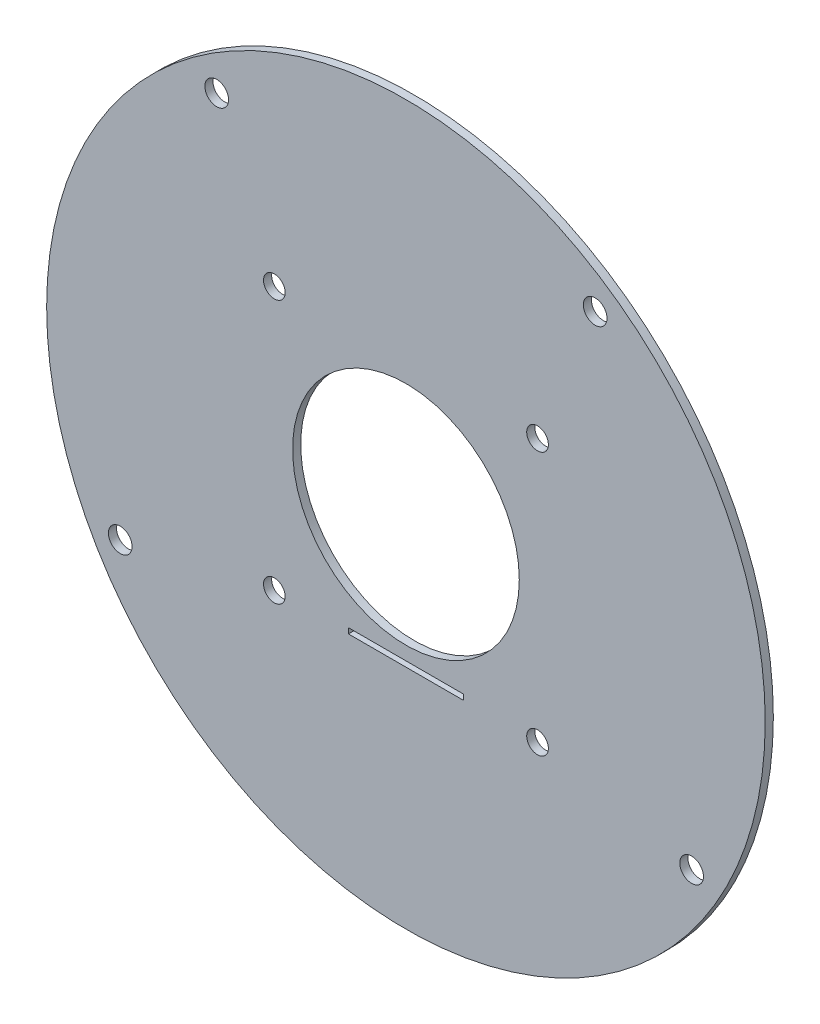
ISO-10303-21;
HEADER;
FILE_DESCRIPTION(('STEP AP214'),'2;1');
FILE_NAME('part.step','',(''),(''),'','','');
FILE_SCHEMA(('AUTOMOTIVE_DESIGN { 1 0 10303 214 1 1 1 1 }'));
ENDSEC;
DATA;
#1=APPLICATION_CONTEXT('core data for automotive mechanical design processes');
#2=APPLICATION_PROTOCOL_DEFINITION('international standard','automotive_design',2000,#1);
#3=PRODUCT_CONTEXT('',#1,'mechanical');
#4=PRODUCT('Part','Part','',(#3));
#5=PRODUCT_RELATED_PRODUCT_CATEGORY('part','',(#4));
#6=PRODUCT_DEFINITION_FORMATION('','',#4);
#7=PRODUCT_DEFINITION_CONTEXT('part definition',#1,'design');
#8=PRODUCT_DEFINITION('design','',#6,#7);
#9=PRODUCT_DEFINITION_SHAPE('','',#8);
#10=(LENGTH_UNIT() NAMED_UNIT(*) SI_UNIT(.MILLI.,.METRE.));
#11=(NAMED_UNIT(*) PLANE_ANGLE_UNIT() SI_UNIT($,.RADIAN.));
#12=(NAMED_UNIT(*) SI_UNIT($,.STERADIAN.) SOLID_ANGLE_UNIT());
#13=UNCERTAINTY_MEASURE_WITH_UNIT(LENGTH_MEASURE(1.E-05),#10,'distance_accuracy_value','');
#14=(GEOMETRIC_REPRESENTATION_CONTEXT(3) GLOBAL_UNCERTAINTY_ASSIGNED_CONTEXT((#13)) GLOBAL_UNIT_ASSIGNED_CONTEXT((#10,
#11,#12)) REPRESENTATION_CONTEXT('',''));
#15=CARTESIAN_POINT('',(0.,0.,0.));
#16=DIRECTION('',(0.,0.,1.));
#17=DIRECTION('',(1.,0.,0.));
#18=AXIS2_PLACEMENT_3D('',#15,#16,#17);
#19=CARTESIAN_POINT('',(0.,0.,1.2));
#20=DIRECTION('',(0.,0.,1.));
#21=DIRECTION('',(1.,0.,0.));
#22=AXIS2_PLACEMENT_3D('',#19,#20,#21);
#23=PLANE('',#22);
#24=CARTESIAN_POINT('',(-27.9606473281638,39.9319427489363,1.2));
#25=DIRECTION('',(0.,0.,1.));
#26=DIRECTION('',(1.,0.,0.));
#27=AXIS2_PLACEMENT_3D('',#24,#25,#26);
#28=CIRCLE('',#27,1.75);
#29=CARTESIAN_POINT('',(-26.2106473281638,39.9319427489363,1.2));
#30=VERTEX_POINT('',#29);
#31=EDGE_CURVE('E90',#30,#30,#28,.T.);
#32=ORIENTED_EDGE('',*,*,#31,.F.);
#33=EDGE_LOOP('',(#32));
#34=FACE_BOUND('',#33,.T.);
#35=CARTESIAN_POINT('',(-42.2169206365848,-24.3739504938896,1.2));
#36=DIRECTION('',(0.,0.,1.));
#37=DIRECTION('',(1.,0.,0.));
#38=AXIS2_PLACEMENT_3D('',#35,#36,#37);
#39=CIRCLE('',#38,1.75);
#40=CARTESIAN_POINT('',(-40.4669206365848,-24.3739504938896,1.2));
#41=VERTEX_POINT('',#40);
#42=EDGE_CURVE('E119',#41,#41,#39,.T.);
#43=ORIENTED_EDGE('',*,*,#42,.F.);
#44=EDGE_LOOP('',(#43));
#45=FACE_BOUND('',#44,.T.);
#46=CARTESIAN_POINT('',(42.2169206365848,-24.3739504938896,1.2));
#47=DIRECTION('',(0.,0.,1.));
#48=DIRECTION('',(1.,0.,0.));
#49=AXIS2_PLACEMENT_3D('',#46,#47,#48);
#50=CIRCLE('',#49,1.75);
#51=CARTESIAN_POINT('',(43.9669206365848,-24.3739504938896,1.2));
#52=VERTEX_POINT('',#51);
#53=EDGE_CURVE('E111',#52,#52,#50,.T.);
#54=ORIENTED_EDGE('',*,*,#53,.F.);
#55=EDGE_LOOP('',(#54));
#56=FACE_BOUND('',#55,.T.);
#57=CARTESIAN_POINT('',(27.9606473281638,39.9319427489363,1.2));
#58=DIRECTION('',(0.,0.,1.));
#59=DIRECTION('',(1.,0.,0.));
#60=AXIS2_PLACEMENT_3D('',#57,#58,#59);
#61=CIRCLE('',#60,1.75);
#62=CARTESIAN_POINT('',(29.7106473281638,39.9319427489363,1.2));
#63=VERTEX_POINT('',#62);
#64=EDGE_CURVE('E118',#63,#63,#61,.T.);
#65=ORIENTED_EDGE('',*,*,#64,.F.);
#66=EDGE_LOOP('',(#65));
#67=FACE_BOUND('',#66,.T.);
#68=CARTESIAN_POINT('',(19.44543648263,19.4454364826302,1.2));
#69=DIRECTION('',(0.,0.,1.));
#70=DIRECTION('',(1.,0.,0.));
#71=AXIS2_PLACEMENT_3D('',#68,#69,#70);
#72=CIRCLE('',#71,1.6);
#73=CARTESIAN_POINT('',(21.04543648263,19.4454364826302,1.2));
#74=VERTEX_POINT('',#73);
#75=EDGE_CURVE('E141',#74,#74,#72,.T.);
#76=ORIENTED_EDGE('',*,*,#75,.F.);
#77=EDGE_LOOP('',(#76));
#78=FACE_BOUND('',#77,.T.);
#79=CARTESIAN_POINT('',(-19.44543648263,-19.4454364826302,1.2));
#80=DIRECTION('',(0.,0.,1.));
#81=DIRECTION('',(1.,0.,0.));
#82=AXIS2_PLACEMENT_3D('',#79,#80,#81);
#83=CIRCLE('',#82,1.6);
#84=CARTESIAN_POINT('',(-17.84543648263,-19.4454364826302,1.2));
#85=VERTEX_POINT('',#84);
#86=EDGE_CURVE('E140',#85,#85,#83,.T.);
#87=ORIENTED_EDGE('',*,*,#86,.F.);
#88=EDGE_LOOP('',(#87));
#89=FACE_BOUND('',#88,.T.);
#90=CARTESIAN_POINT('',(19.44543648263,-19.4454364826302,1.2));
#91=DIRECTION('',(0.,0.,1.));
#92=DIRECTION('',(1.,0.,0.));
#93=AXIS2_PLACEMENT_3D('',#90,#91,#92);
#94=CIRCLE('',#93,1.6);
#95=CARTESIAN_POINT('',(21.0454364826299,-19.4454364826302,1.2));
#96=VERTEX_POINT('',#95);
#97=EDGE_CURVE('E134',#96,#96,#94,.T.);
#98=ORIENTED_EDGE('',*,*,#97,.F.);
#99=EDGE_LOOP('',(#98));
#100=FACE_BOUND('',#99,.T.);
#101=CARTESIAN_POINT('',(-19.44543648263,19.4454364826302,1.2));
#102=DIRECTION('',(0.,0.,1.));
#103=DIRECTION('',(1.,0.,0.));
#104=AXIS2_PLACEMENT_3D('',#101,#102,#103);
#105=CIRCLE('',#104,1.60000000000001);
#106=CARTESIAN_POINT('',(-17.8454364826299,19.4454364826302,1.2));
#107=VERTEX_POINT('',#106);
#108=EDGE_CURVE('E148',#107,#107,#105,.T.);
#109=ORIENTED_EDGE('',*,*,#108,.F.);
#110=EDGE_LOOP('',(#109));
#111=FACE_BOUND('',#110,.T.);
#112=CARTESIAN_POINT('',(0.,0.,1.2));
#113=DIRECTION('',(0.,0.,1.));
#114=DIRECTION('',(1.,0.,0.));
#115=AXIS2_PLACEMENT_3D('',#112,#113,#114);
#116=CIRCLE('',#115,53.0919653926707);
#117=CARTESIAN_POINT('',(53.0919653926707,0.,1.2));
#118=VERTEX_POINT('',#117);
#119=EDGE_CURVE('E11',#118,#118,#116,.T.);
#120=ORIENTED_EDGE('',*,*,#119,.T.);
#121=EDGE_LOOP('',(#120));
#122=FACE_BOUND('',#121,.T.);
#123=CARTESIAN_POINT('',(0.,0.,1.2));
#124=DIRECTION('',(0.,0.,1.));
#125=DIRECTION('',(1.,0.,0.));
#126=AXIS2_PLACEMENT_3D('',#123,#124,#125);
#127=CIRCLE('',#126,16.7505485799082);
#128=CARTESIAN_POINT('',(16.7505485799082,0.,1.2));
#129=VERTEX_POINT('',#128);
#130=EDGE_CURVE('E159',#129,#129,#127,.T.);
#131=ORIENTED_EDGE('',*,*,#130,.F.);
#132=EDGE_LOOP('',(#131));
#133=FACE_BOUND('',#132,.T.);
#134=DIRECTION('',(0.,-1.,0.));
#135=VECTOR('',#134,1.);
#136=CARTESIAN_POINT('',(-8.5,-18.7505485799082,1.2));
#137=LINE('',#136,#135);
#138=CARTESIAN_POINT('',(-8.5,-18.7505485799082,1.2));
#139=VERTEX_POINT('',#138);
#140=CARTESIAN_POINT('',(-8.5,-19.5505485799074,1.2));
#141=VERTEX_POINT('',#140);
#142=EDGE_CURVE('E94',#139,#141,#137,.T.);
#143=ORIENTED_EDGE('',*,*,#142,.F.);
#144=DIRECTION('',(-1.,0.,0.));
#145=VECTOR('',#144,1.);
#146=CARTESIAN_POINT('',(8.5,-18.7505485799082,1.2));
#147=LINE('',#146,#145);
#148=CARTESIAN_POINT('',(8.5,-18.7505485799082,1.2));
#149=VERTEX_POINT('',#148);
#150=EDGE_CURVE('E78',#149,#139,#147,.T.);
#151=ORIENTED_EDGE('',*,*,#150,.F.);
#152=DIRECTION('',(0.,1.,0.));
#153=VECTOR('',#152,1.);
#154=CARTESIAN_POINT('',(8.5,-19.5505485799074,1.2));
#155=LINE('',#154,#153);
#156=CARTESIAN_POINT('',(8.5,-19.5505485799074,1.2));
#157=VERTEX_POINT('',#156);
#158=EDGE_CURVE('E87',#157,#149,#155,.T.);
#159=ORIENTED_EDGE('',*,*,#158,.F.);
#160=DIRECTION('',(1.,0.,0.));
#161=VECTOR('',#160,1.);
#162=CARTESIAN_POINT('',(-8.5,-19.5505485799074,1.2));
#163=LINE('',#162,#161);
#164=EDGE_CURVE('E50',#141,#157,#163,.T.);
#165=ORIENTED_EDGE('',*,*,#164,.F.);
#166=EDGE_LOOP('',(#143,#151,#159,#165));
#167=FACE_BOUND('',#166,.T.);
#168=ADVANCED_FACE('F35',(#34,#45,#56,#67,#78,#89,#100,#111,#122,#133,#167),#23,.T.);
#169=CARTESIAN_POINT('',(0.,0.,0.));
#170=DIRECTION('',(0.,0.,1.));
#171=DIRECTION('',(1.,0.,0.));
#172=AXIS2_PLACEMENT_3D('',#169,#170,#171);
#173=PLANE('',#172);
#174=CARTESIAN_POINT('',(0.,0.,0.));
#175=DIRECTION('',(0.,0.,1.));
#176=DIRECTION('',(1.,0.,0.));
#177=AXIS2_PLACEMENT_3D('',#174,#175,#176);
#178=CIRCLE('',#177,16.7505485799082);
#179=CARTESIAN_POINT('',(16.7505485799082,0.,0.));
#180=VERTEX_POINT('',#179);
#181=EDGE_CURVE('E158',#180,#180,#178,.T.);
#182=ORIENTED_EDGE('',*,*,#181,.T.);
#183=EDGE_LOOP('',(#182));
#184=FACE_BOUND('',#183,.T.);
#185=CARTESIAN_POINT('',(0.,0.,0.));
#186=DIRECTION('',(0.,0.,1.));
#187=DIRECTION('',(1.,0.,0.));
#188=AXIS2_PLACEMENT_3D('',#185,#186,#187);
#189=CIRCLE('',#188,53.0919653926707);
#190=CARTESIAN_POINT('',(53.0919653926707,0.,0.));
#191=VERTEX_POINT('',#190);
#192=EDGE_CURVE('E39',#191,#191,#189,.T.);
#193=ORIENTED_EDGE('',*,*,#192,.F.);
#194=EDGE_LOOP('',(#193));
#195=FACE_BOUND('',#194,.T.);
#196=CARTESIAN_POINT('',(-19.44543648263,19.4454364826302,0.));
#197=DIRECTION('',(0.,0.,1.));
#198=DIRECTION('',(1.,0.,0.));
#199=AXIS2_PLACEMENT_3D('',#196,#197,#198);
#200=CIRCLE('',#199,1.60000000000001);
#201=CARTESIAN_POINT('',(-17.8454364826299,19.4454364826302,0.));
#202=VERTEX_POINT('',#201);
#203=EDGE_CURVE('E155',#202,#202,#200,.F.);
#204=ORIENTED_EDGE('',*,*,#203,.F.);
#205=EDGE_LOOP('',(#204));
#206=FACE_BOUND('',#205,.T.);
#207=CARTESIAN_POINT('',(19.44543648263,-19.4454364826302,0.));
#208=DIRECTION('',(0.,0.,1.));
#209=DIRECTION('',(1.,0.,0.));
#210=AXIS2_PLACEMENT_3D('',#207,#208,#209);
#211=CIRCLE('',#210,1.6);
#212=CARTESIAN_POINT('',(21.0454364826299,-19.4454364826302,0.));
#213=VERTEX_POINT('',#212);
#214=EDGE_CURVE('E137',#213,#213,#211,.F.);
#215=ORIENTED_EDGE('',*,*,#214,.F.);
#216=EDGE_LOOP('',(#215));
#217=FACE_BOUND('',#216,.T.);
#218=CARTESIAN_POINT('',(-19.44543648263,-19.4454364826302,0.));
#219=DIRECTION('',(0.,0.,1.));
#220=DIRECTION('',(1.,0.,0.));
#221=AXIS2_PLACEMENT_3D('',#218,#219,#220);
#222=CIRCLE('',#221,1.6);
#223=CARTESIAN_POINT('',(-17.84543648263,-19.4454364826302,0.));
#224=VERTEX_POINT('',#223);
#225=EDGE_CURVE('E145',#224,#224,#222,.F.);
#226=ORIENTED_EDGE('',*,*,#225,.F.);
#227=EDGE_LOOP('',(#226));
#228=FACE_BOUND('',#227,.T.);
#229=CARTESIAN_POINT('',(19.44543648263,19.4454364826302,0.));
#230=DIRECTION('',(0.,0.,1.));
#231=DIRECTION('',(1.,0.,0.));
#232=AXIS2_PLACEMENT_3D('',#229,#230,#231);
#233=CIRCLE('',#232,1.6);
#234=CARTESIAN_POINT('',(21.04543648263,19.4454364826302,0.));
#235=VERTEX_POINT('',#234);
#236=EDGE_CURVE('E144',#235,#235,#233,.F.);
#237=ORIENTED_EDGE('',*,*,#236,.F.);
#238=EDGE_LOOP('',(#237));
#239=FACE_BOUND('',#238,.T.);
#240=CARTESIAN_POINT('',(27.9606473281638,39.9319427489363,0.));
#241=DIRECTION('',(0.,0.,1.));
#242=DIRECTION('',(1.,0.,0.));
#243=AXIS2_PLACEMENT_3D('',#240,#241,#242);
#244=CIRCLE('',#243,1.75);
#245=CARTESIAN_POINT('',(29.7106473281638,39.9319427489363,0.));
#246=VERTEX_POINT('',#245);
#247=EDGE_CURVE('E131',#246,#246,#244,.F.);
#248=ORIENTED_EDGE('',*,*,#247,.F.);
#249=EDGE_LOOP('',(#248));
#250=FACE_BOUND('',#249,.T.);
#251=CARTESIAN_POINT('',(42.2169206365848,-24.3739504938896,0.));
#252=DIRECTION('',(0.,0.,1.));
#253=DIRECTION('',(1.,0.,0.));
#254=AXIS2_PLACEMENT_3D('',#251,#252,#253);
#255=CIRCLE('',#254,1.75);
#256=CARTESIAN_POINT('',(43.9669206365848,-24.3739504938896,0.));
#257=VERTEX_POINT('',#256);
#258=EDGE_CURVE('E114',#257,#257,#255,.F.);
#259=ORIENTED_EDGE('',*,*,#258,.F.);
#260=EDGE_LOOP('',(#259));
#261=FACE_BOUND('',#260,.T.);
#262=CARTESIAN_POINT('',(-42.2169206365848,-24.3739504938896,0.));
#263=DIRECTION('',(0.,0.,1.));
#264=DIRECTION('',(1.,0.,0.));
#265=AXIS2_PLACEMENT_3D('',#262,#263,#264);
#266=CIRCLE('',#265,1.75);
#267=CARTESIAN_POINT('',(-40.4669206365848,-24.3739504938896,0.));
#268=VERTEX_POINT('',#267);
#269=EDGE_CURVE('E115',#268,#268,#266,.F.);
#270=ORIENTED_EDGE('',*,*,#269,.F.);
#271=EDGE_LOOP('',(#270));
#272=FACE_BOUND('',#271,.T.);
#273=CARTESIAN_POINT('',(-27.9606473281638,39.9319427489363,0.));
#274=DIRECTION('',(0.,0.,1.));
#275=DIRECTION('',(1.,0.,0.));
#276=AXIS2_PLACEMENT_3D('',#273,#274,#275);
#277=CIRCLE('',#276,1.75);
#278=CARTESIAN_POINT('',(-26.2106473281638,39.9319427489363,0.));
#279=VERTEX_POINT('',#278);
#280=EDGE_CURVE('E122',#279,#279,#277,.F.);
#281=ORIENTED_EDGE('',*,*,#280,.F.);
#282=EDGE_LOOP('',(#281));
#283=FACE_BOUND('',#282,.T.);
#284=DIRECTION('',(-1.,0.,0.));
#285=VECTOR('',#284,1.);
#286=CARTESIAN_POINT('',(8.5,-18.7505485799082,0.));
#287=LINE('',#286,#285);
#288=CARTESIAN_POINT('',(8.5,-18.7505485799082,0.));
#289=VERTEX_POINT('',#288);
#290=CARTESIAN_POINT('',(-8.5,-18.7505485799082,0.));
#291=VERTEX_POINT('',#290);
#292=EDGE_CURVE('E58',#289,#291,#287,.T.);
#293=ORIENTED_EDGE('',*,*,#292,.T.);
#294=DIRECTION('',(0.,-1.,0.));
#295=VECTOR('',#294,1.);
#296=CARTESIAN_POINT('',(-8.5,-18.7505485799082,0.));
#297=LINE('',#296,#295);
#298=CARTESIAN_POINT('',(-8.5,-19.5505485799074,0.));
#299=VERTEX_POINT('',#298);
#300=EDGE_CURVE('E96',#291,#299,#297,.T.);
#301=ORIENTED_EDGE('',*,*,#300,.T.);
#302=DIRECTION('',(1.,0.,0.));
#303=VECTOR('',#302,1.);
#304=CARTESIAN_POINT('',(-8.5,-19.5505485799074,0.));
#305=LINE('',#304,#303);
#306=CARTESIAN_POINT('',(8.5,-19.5505485799074,0.));
#307=VERTEX_POINT('',#306);
#308=EDGE_CURVE('E103',#299,#307,#305,.T.);
#309=ORIENTED_EDGE('',*,*,#308,.T.);
#310=DIRECTION('',(0.,1.,0.));
#311=VECTOR('',#310,1.);
#312=CARTESIAN_POINT('',(8.5,-19.5505485799074,0.));
#313=LINE('',#312,#311);
#314=EDGE_CURVE('E84',#307,#289,#313,.T.);
#315=ORIENTED_EDGE('',*,*,#314,.T.);
#316=EDGE_LOOP('',(#293,#301,#309,#315));
#317=FACE_BOUND('',#316,.T.);
#318=ADVANCED_FACE('F165',(#184,#195,#206,#217,#228,#239,#250,#261,#272,#283,#317),#173,.F.);
#319=CARTESIAN_POINT('',(0.,0.,1.2));
#320=DIRECTION('',(0.,0.,-1.));
#321=DIRECTION('',(-1.,0.,0.));
#322=AXIS2_PLACEMENT_3D('',#319,#320,#321);
#323=CYLINDRICAL_SURFACE('',#322,53.0919653926707);
#324=ORIENTED_EDGE('',*,*,#119,.F.);
#325=EDGE_LOOP('',(#324));
#326=FACE_BOUND('',#325,.T.);
#327=ORIENTED_EDGE('',*,*,#192,.T.);
#328=EDGE_LOOP('',(#327));
#329=FACE_BOUND('',#328,.T.);
#330=ADVANCED_FACE('F37',(#326,#329),#323,.T.);
#331=CARTESIAN_POINT('',(0.,0.,1.2));
#332=DIRECTION('',(0.,0.,-1.));
#333=DIRECTION('',(-1.,0.,0.));
#334=AXIS2_PLACEMENT_3D('',#331,#332,#333);
#335=CYLINDRICAL_SURFACE('',#334,16.7505485799082);
#336=ORIENTED_EDGE('',*,*,#130,.T.);
#337=EDGE_LOOP('',(#336));
#338=FACE_BOUND('',#337,.T.);
#339=ORIENTED_EDGE('',*,*,#181,.F.);
#340=EDGE_LOOP('',(#339));
#341=FACE_BOUND('',#340,.T.);
#342=ADVANCED_FACE('F168',(#338,#341),#335,.F.);
#343=CARTESIAN_POINT('',(-19.44543648263,19.4454364826302,-0.000999999999999916));
#344=DIRECTION('',(0.,0.,1.));
#345=DIRECTION('',(1.,0.,0.));
#346=AXIS2_PLACEMENT_3D('',#343,#344,#345);
#347=CYLINDRICAL_SURFACE('',#346,1.60000000000001);
#348=ORIENTED_EDGE('',*,*,#108,.T.);
#349=EDGE_LOOP('',(#348));
#350=FACE_BOUND('',#349,.T.);
#351=ORIENTED_EDGE('',*,*,#203,.T.);
#352=EDGE_LOOP('',(#351));
#353=FACE_BOUND('',#352,.T.);
#354=ADVANCED_FACE('F170',(#350,#353),#347,.F.);
#355=CARTESIAN_POINT('',(19.44543648263,-19.4454364826302,-0.000999999999999916));
#356=DIRECTION('',(0.,0.,1.));
#357=DIRECTION('',(1.,0.,0.));
#358=AXIS2_PLACEMENT_3D('',#355,#356,#357);
#359=CYLINDRICAL_SURFACE('',#358,1.6);
#360=ORIENTED_EDGE('',*,*,#97,.T.);
#361=EDGE_LOOP('',(#360));
#362=FACE_BOUND('',#361,.T.);
#363=ORIENTED_EDGE('',*,*,#214,.T.);
#364=EDGE_LOOP('',(#363));
#365=FACE_BOUND('',#364,.T.);
#366=ADVANCED_FACE('F177',(#362,#365),#359,.F.);
#367=CARTESIAN_POINT('',(-19.44543648263,-19.4454364826302,-0.000999999999999916));
#368=DIRECTION('',(0.,0.,1.));
#369=DIRECTION('',(1.,0.,0.));
#370=AXIS2_PLACEMENT_3D('',#367,#368,#369);
#371=CYLINDRICAL_SURFACE('',#370,1.6);
#372=ORIENTED_EDGE('',*,*,#86,.T.);
#373=EDGE_LOOP('',(#372));
#374=FACE_BOUND('',#373,.T.);
#375=ORIENTED_EDGE('',*,*,#225,.T.);
#376=EDGE_LOOP('',(#375));
#377=FACE_BOUND('',#376,.T.);
#378=ADVANCED_FACE('F260',(#374,#377),#371,.F.);
#379=CARTESIAN_POINT('',(19.44543648263,19.4454364826302,-0.000999999999999916));
#380=DIRECTION('',(0.,0.,1.));
#381=DIRECTION('',(1.,0.,0.));
#382=AXIS2_PLACEMENT_3D('',#379,#380,#381);
#383=CYLINDRICAL_SURFACE('',#382,1.6);
#384=ORIENTED_EDGE('',*,*,#75,.T.);
#385=EDGE_LOOP('',(#384));
#386=FACE_BOUND('',#385,.T.);
#387=ORIENTED_EDGE('',*,*,#236,.T.);
#388=EDGE_LOOP('',(#387));
#389=FACE_BOUND('',#388,.T.);
#390=ADVANCED_FACE('F256',(#386,#389),#383,.F.);
#391=CARTESIAN_POINT('',(27.9606473281638,39.9319427489363,-0.000999999999999916));
#392=DIRECTION('',(0.,0.,1.));
#393=DIRECTION('',(1.,0.,0.));
#394=AXIS2_PLACEMENT_3D('',#391,#392,#393);
#395=CYLINDRICAL_SURFACE('',#394,1.75);
#396=ORIENTED_EDGE('',*,*,#64,.T.);
#397=EDGE_LOOP('',(#396));
#398=FACE_BOUND('',#397,.T.);
#399=ORIENTED_EDGE('',*,*,#247,.T.);
#400=EDGE_LOOP('',(#399));
#401=FACE_BOUND('',#400,.T.);
#402=ADVANCED_FACE('F246',(#398,#401),#395,.F.);
#403=CARTESIAN_POINT('',(42.2169206365848,-24.3739504938896,-0.000999999999999916));
#404=DIRECTION('',(0.,0.,1.));
#405=DIRECTION('',(1.,0.,0.));
#406=AXIS2_PLACEMENT_3D('',#403,#404,#405);
#407=CYLINDRICAL_SURFACE('',#406,1.75);
#408=ORIENTED_EDGE('',*,*,#53,.T.);
#409=EDGE_LOOP('',(#408));
#410=FACE_BOUND('',#409,.T.);
#411=ORIENTED_EDGE('',*,*,#258,.T.);
#412=EDGE_LOOP('',(#411));
#413=FACE_BOUND('',#412,.T.);
#414=ADVANCED_FACE('F242',(#410,#413),#407,.F.);
#415=CARTESIAN_POINT('',(-42.2169206365848,-24.3739504938896,-0.000999999999999916));
#416=DIRECTION('',(0.,0.,1.));
#417=DIRECTION('',(1.,0.,0.));
#418=AXIS2_PLACEMENT_3D('',#415,#416,#417);
#419=CYLINDRICAL_SURFACE('',#418,1.75);
#420=ORIENTED_EDGE('',*,*,#42,.T.);
#421=EDGE_LOOP('',(#420));
#422=FACE_BOUND('',#421,.T.);
#423=ORIENTED_EDGE('',*,*,#269,.T.);
#424=EDGE_LOOP('',(#423));
#425=FACE_BOUND('',#424,.T.);
#426=ADVANCED_FACE('F245',(#422,#425),#419,.F.);
#427=CARTESIAN_POINT('',(-27.9606473281638,39.9319427489363,-0.000999999999999916));
#428=DIRECTION('',(0.,0.,1.));
#429=DIRECTION('',(1.,0.,0.));
#430=AXIS2_PLACEMENT_3D('',#427,#428,#429);
#431=CYLINDRICAL_SURFACE('',#430,1.75);
#432=ORIENTED_EDGE('',*,*,#31,.T.);
#433=EDGE_LOOP('',(#432));
#434=FACE_BOUND('',#433,.T.);
#435=ORIENTED_EDGE('',*,*,#280,.T.);
#436=EDGE_LOOP('',(#435));
#437=FACE_BOUND('',#436,.T.);
#438=ADVANCED_FACE('F238',(#434,#437),#431,.F.);
#439=CARTESIAN_POINT('',(8.5,-18.7505485799082,1.201));
#440=DIRECTION('',(0.,-1.,0.));
#441=DIRECTION('',(0.,0.,-1.));
#442=AXIS2_PLACEMENT_3D('',#439,#440,#441);
#443=PLANE('',#442);
#444=ORIENTED_EDGE('',*,*,#150,.T.);
#445=DIRECTION('',(0.,0.,-1.));
#446=VECTOR('',#445,1.);
#447=CARTESIAN_POINT('',(-8.5,-18.7505485799082,1.201));
#448=LINE('',#447,#446);
#449=EDGE_CURVE('E91',#139,#291,#448,.T.);
#450=ORIENTED_EDGE('',*,*,#449,.T.);
#451=ORIENTED_EDGE('',*,*,#292,.F.);
#452=DIRECTION('',(0.,0.,-1.));
#453=VECTOR('',#452,1.);
#454=CARTESIAN_POINT('',(8.5,-18.7505485799082,1.201));
#455=LINE('',#454,#453);
#456=EDGE_CURVE('E74',#149,#289,#455,.T.);
#457=ORIENTED_EDGE('',*,*,#456,.F.);
#458=EDGE_LOOP('',(#444,#450,#451,#457));
#459=FACE_BOUND('',#458,.T.);
#460=ADVANCED_FACE('F76',(#459),#443,.T.);
#461=CARTESIAN_POINT('',(-8.5,-18.7505485799082,1.201));
#462=DIRECTION('',(1.,0.,0.));
#463=DIRECTION('',(0.,1.,0.));
#464=AXIS2_PLACEMENT_3D('',#461,#462,#463);
#465=PLANE('',#464);
#466=ORIENTED_EDGE('',*,*,#142,.T.);
#467=DIRECTION('',(0.,0.,-1.));
#468=VECTOR('',#467,1.);
#469=CARTESIAN_POINT('',(-8.5,-19.5505485799074,1.201));
#470=LINE('',#469,#468);
#471=EDGE_CURVE('E108',#141,#299,#470,.T.);
#472=ORIENTED_EDGE('',*,*,#471,.T.);
#473=ORIENTED_EDGE('',*,*,#300,.F.);
#474=ORIENTED_EDGE('',*,*,#449,.F.);
#475=EDGE_LOOP('',(#466,#472,#473,#474));
#476=FACE_BOUND('',#475,.T.);
#477=ADVANCED_FACE('F230',(#476),#465,.T.);
#478=CARTESIAN_POINT('',(-8.5,-19.5505485799074,1.201));
#479=DIRECTION('',(0.,1.,0.));
#480=DIRECTION('',(0.,0.,1.));
#481=AXIS2_PLACEMENT_3D('',#478,#479,#480);
#482=PLANE('',#481);
#483=ORIENTED_EDGE('',*,*,#164,.T.);
#484=DIRECTION('',(0.,0.,-1.));
#485=VECTOR('',#484,1.);
#486=CARTESIAN_POINT('',(8.5,-19.5505485799074,1.201));
#487=LINE('',#486,#485);
#488=EDGE_CURVE('E83',#157,#307,#487,.T.);
#489=ORIENTED_EDGE('',*,*,#488,.T.);
#490=ORIENTED_EDGE('',*,*,#308,.F.);
#491=ORIENTED_EDGE('',*,*,#471,.F.);
#492=EDGE_LOOP('',(#483,#489,#490,#491));
#493=FACE_BOUND('',#492,.T.);
#494=ADVANCED_FACE('F228',(#493),#482,.T.);
#495=CARTESIAN_POINT('',(8.5,-19.5505485799074,1.201));
#496=DIRECTION('',(-1.,0.,0.));
#497=DIRECTION('',(0.,-1.,0.));
#498=AXIS2_PLACEMENT_3D('',#495,#496,#497);
#499=PLANE('',#498);
#500=ORIENTED_EDGE('',*,*,#158,.T.);
#501=ORIENTED_EDGE('',*,*,#456,.T.);
#502=ORIENTED_EDGE('',*,*,#314,.F.);
#503=ORIENTED_EDGE('',*,*,#488,.F.);
#504=EDGE_LOOP('',(#500,#501,#502,#503));
#505=FACE_BOUND('',#504,.T.);
#506=ADVANCED_FACE('F88',(#505),#499,.T.);
#507=CLOSED_SHELL('',(#168,#318,#330,#342,#354,#366,#378,#390,#402,#414,#426,#438,#460,#477,
#494,#506));
#508=MANIFOLD_SOLID_BREP('B2',#507);
#509=ADVANCED_BREP_SHAPE_REPRESENTATION('',(#18,#508),#14);
#510=SHAPE_DEFINITION_REPRESENTATION(#9,#509);
ENDSEC;
END-ISO-10303-21;
